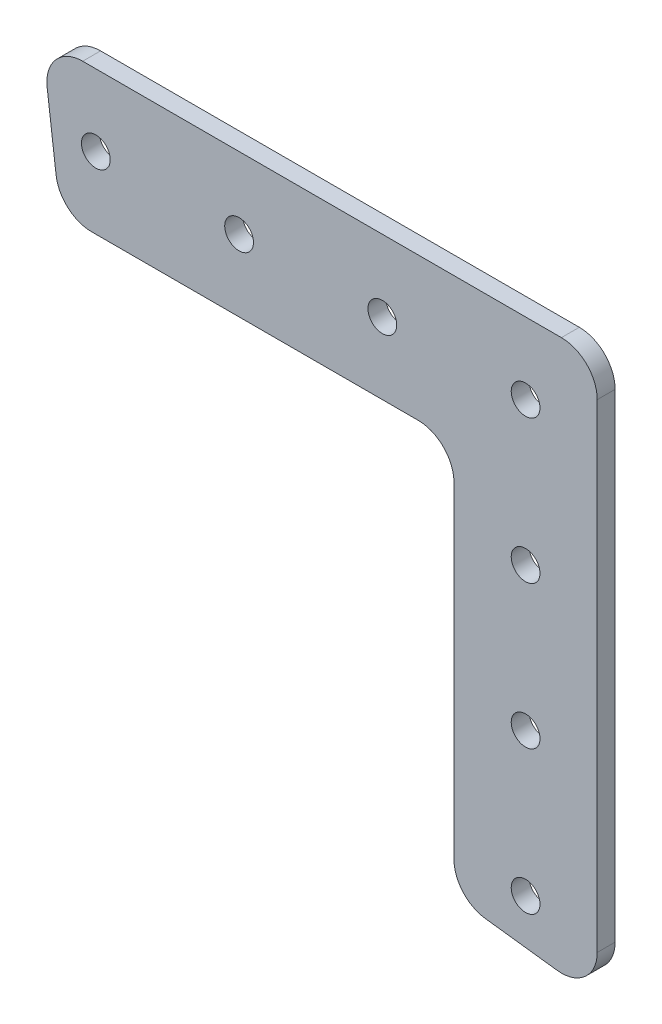
ISO-10303-21;
HEADER;
FILE_DESCRIPTION(('STEP AP214'),'2;1');
FILE_NAME('part.step','',(''),(''),'','','');
FILE_SCHEMA(('AUTOMOTIVE_DESIGN { 1 0 10303 214 1 1 1 1 }'));
ENDSEC;
DATA;
#1=APPLICATION_CONTEXT('core data for automotive mechanical design processes');
#2=APPLICATION_PROTOCOL_DEFINITION('international standard','automotive_design',2000,#1);
#3=PRODUCT_CONTEXT('',#1,'mechanical');
#4=PRODUCT('Part','Part','',(#3));
#5=PRODUCT_RELATED_PRODUCT_CATEGORY('part','',(#4));
#6=PRODUCT_DEFINITION_FORMATION('','',#4);
#7=PRODUCT_DEFINITION_CONTEXT('part definition',#1,'design');
#8=PRODUCT_DEFINITION('design','',#6,#7);
#9=PRODUCT_DEFINITION_SHAPE('','',#8);
#10=(LENGTH_UNIT() NAMED_UNIT(*) SI_UNIT(.MILLI.,.METRE.));
#11=(NAMED_UNIT(*) PLANE_ANGLE_UNIT() SI_UNIT($,.RADIAN.));
#12=(NAMED_UNIT(*) SI_UNIT($,.STERADIAN.) SOLID_ANGLE_UNIT());
#13=UNCERTAINTY_MEASURE_WITH_UNIT(LENGTH_MEASURE(1.E-05),#10,'distance_accuracy_value','');
#14=(GEOMETRIC_REPRESENTATION_CONTEXT(3) GLOBAL_UNCERTAINTY_ASSIGNED_CONTEXT((#13)) GLOBAL_UNIT_ASSIGNED_CONTEXT((#10,
#11,#12)) REPRESENTATION_CONTEXT('',''));
#15=CARTESIAN_POINT('',(0.,0.,0.));
#16=DIRECTION('',(0.,0.,1.));
#17=DIRECTION('',(1.,0.,0.));
#18=AXIS2_PLACEMENT_3D('',#15,#16,#17);
#19=CARTESIAN_POINT('',(6.35000000000038,251.668167087712,0.));
#20=DIRECTION('',(0.,0.,1.));
#21=DIRECTION('',(1.,0.,0.));
#22=AXIS2_PLACEMENT_3D('',#19,#20,#21);
#23=PLANE('',#22);
#24=CARTESIAN_POINT('',(2.25026312494075E-12,330.199999999997,0.));
#25=DIRECTION('',(0.,0.,-1.));
#26=DIRECTION('',(-1.,0.,0.));
#27=AXIS2_PLACEMENT_3D('',#24,#25,#26);
#28=CIRCLE('',#27,2.55269999999999);
#29=CARTESIAN_POINT('',(-2.55269999999774,330.199999999997,0.));
#30=VERTEX_POINT('',#29);
#31=EDGE_CURVE('E201',#30,#30,#28,.T.);
#32=ORIENTED_EDGE('',*,*,#31,.F.);
#33=EDGE_LOOP('',(#32));
#34=FACE_BOUND('',#33,.T.);
#35=CARTESIAN_POINT('',(2.07289587292752E-12,304.799999999998,0.));
#36=DIRECTION('',(0.,0.,-1.));
#37=DIRECTION('',(-1.,0.,0.));
#38=AXIS2_PLACEMENT_3D('',#35,#36,#37);
#39=CIRCLE('',#38,2.55269999999999);
#40=CARTESIAN_POINT('',(-2.55269999999792,304.799999999998,0.));
#41=VERTEX_POINT('',#40);
#42=EDGE_CURVE('E190',#41,#41,#39,.T.);
#43=ORIENTED_EDGE('',*,*,#42,.F.);
#44=EDGE_LOOP('',(#43));
#45=FACE_BOUND('',#44,.T.);
#46=CARTESIAN_POINT('',(2.22044604925031E-13,279.4,0.));
#47=DIRECTION('',(0.,0.,-1.));
#48=DIRECTION('',(-1.,0.,0.));
#49=AXIS2_PLACEMENT_3D('',#46,#47,#48);
#50=CIRCLE('',#49,2.55269999999999);
#51=CARTESIAN_POINT('',(-2.55269999999977,279.4,0.));
#52=VERTEX_POINT('',#51);
#53=EDGE_CURVE('E189',#52,#52,#50,.T.);
#54=ORIENTED_EDGE('',*,*,#53,.F.);
#55=EDGE_LOOP('',(#54));
#56=FACE_BOUND('',#55,.T.);
#57=CARTESIAN_POINT('',(-25.3999999999977,330.199999999998,0.));
#58=DIRECTION('',(0.,0.,-1.));
#59=DIRECTION('',(-1.,0.,0.));
#60=AXIS2_PLACEMENT_3D('',#57,#58,#59);
#61=CIRCLE('',#60,2.55269999999999);
#62=CARTESIAN_POINT('',(-27.9526999999977,330.199999999998,0.));
#63=VERTEX_POINT('',#62);
#64=EDGE_CURVE('E186',#63,#63,#61,.T.);
#65=ORIENTED_EDGE('',*,*,#64,.F.);
#66=EDGE_LOOP('',(#65));
#67=FACE_BOUND('',#66,.T.);
#68=CARTESIAN_POINT('',(2.22044604925031E-13,254.,0.));
#69=DIRECTION('',(0.,0.,-1.));
#70=DIRECTION('',(-1.,0.,0.));
#71=AXIS2_PLACEMENT_3D('',#68,#69,#70);
#72=CIRCLE('',#71,2.55269999999999);
#73=CARTESIAN_POINT('',(-2.55269999999977,254.,0.));
#74=VERTEX_POINT('',#73);
#75=EDGE_CURVE('E183',#74,#74,#72,.T.);
#76=ORIENTED_EDGE('',*,*,#75,.F.);
#77=EDGE_LOOP('',(#76));
#78=FACE_BOUND('',#77,.T.);
#79=CARTESIAN_POINT('',(-50.7999999999998,330.2,0.));
#80=DIRECTION('',(0.,0.,-1.));
#81=DIRECTION('',(-1.,0.,0.));
#82=AXIS2_PLACEMENT_3D('',#79,#80,#81);
#83=CIRCLE('',#82,2.55269999999999);
#84=CARTESIAN_POINT('',(-53.3526999999998,330.2,0.));
#85=VERTEX_POINT('',#84);
#86=EDGE_CURVE('E179',#85,#85,#83,.T.);
#87=ORIENTED_EDGE('',*,*,#86,.F.);
#88=EDGE_LOOP('',(#87));
#89=FACE_BOUND('',#88,.T.);
#90=DIRECTION('',(1.,0.,0.));
#91=VECTOR('',#90,1.);
#92=CARTESIAN_POINT('',(-12.6999999999978,317.499999999997,0.));
#93=LINE('',#92,#91);
#94=CARTESIAN_POINT('',(-76.9443329122879,317.5,0.));
#95=VERTEX_POINT('',#94);
#96=CARTESIAN_POINT('',(-19.0499999999978,317.499999999998,0.));
#97=VERTEX_POINT('',#96);
#98=EDGE_CURVE('E245',#95,#97,#93,.T.);
#99=ORIENTED_EDGE('',*,*,#98,.F.);
#100=CARTESIAN_POINT('',(-76.9443329122877,323.85,0.));
#101=DIRECTION('',(0.,0.,1.));
#102=DIRECTION('',(1.,0.,0.));
#103=AXIS2_PLACEMENT_3D('',#100,#101,#102);
#104=CIRCLE('',#103,6.35);
#105=CARTESIAN_POINT('',(-83.2452974294195,323.062379435358,0.));
#106=VERTEX_POINT('',#105);
#107=EDGE_CURVE('E161',#95,#106,#104,.F.);
#108=ORIENTED_EDGE('',*,*,#107,.T.);
#109=DIRECTION('',(0.1240347345892,-0.992277876713669,0.));
#110=VECTOR('',#109,1.);
#111=CARTESIAN_POINT('',(-84.8327974294194,335.762379435359,0.));
#112=LINE('',#111,#110);
#113=CARTESIAN_POINT('',(-84.8327974294194,335.762379435359,0.));
#114=VERTEX_POINT('',#113);
#115=EDGE_CURVE('E242',#114,#106,#112,.T.);
#116=ORIENTED_EDGE('',*,*,#115,.F.);
#117=CARTESIAN_POINT('',(-78.5318329122876,336.55,0.));
#118=DIRECTION('',(0.,0.,1.));
#119=DIRECTION('',(1.,0.,0.));
#120=AXIS2_PLACEMENT_3D('',#117,#118,#119);
#121=CIRCLE('',#120,6.35000000000001);
#122=CARTESIAN_POINT('',(-78.5318329122876,342.9,0.));
#123=VERTEX_POINT('',#122);
#124=EDGE_CURVE('E240',#123,#114,#121,.T.);
#125=ORIENTED_EDGE('',*,*,#124,.F.);
#126=DIRECTION('',(-1.,0.,0.));
#127=VECTOR('',#126,1.);
#128=CARTESIAN_POINT('',(6.35000000000039,342.9,0.));
#129=LINE('',#128,#127);
#130=CARTESIAN_POINT('',(6.35000000000039,342.9,0.));
#131=VERTEX_POINT('',#130);
#132=EDGE_CURVE('E238',#131,#123,#129,.T.);
#133=ORIENTED_EDGE('',*,*,#132,.F.);
#134=CARTESIAN_POINT('',(6.35000000000039,336.55,0.));
#135=DIRECTION('',(0.,0.,1.));
#136=DIRECTION('',(1.,0.,0.));
#137=AXIS2_PLACEMENT_3D('',#134,#135,#136);
#138=CIRCLE('',#137,6.35000000000001);
#139=CARTESIAN_POINT('',(12.7000000000004,336.55,0.));
#140=VERTEX_POINT('',#139);
#141=EDGE_CURVE('E236',#140,#131,#138,.T.);
#142=ORIENTED_EDGE('',*,*,#141,.F.);
#143=DIRECTION('',(0.,1.,0.));
#144=VECTOR('',#143,1.);
#145=CARTESIAN_POINT('',(12.7000000000004,251.668167087712,0.));
#146=LINE('',#145,#144);
#147=CARTESIAN_POINT('',(12.7000000000004,251.668167087712,0.));
#148=VERTEX_POINT('',#147);
#149=EDGE_CURVE('E234',#148,#140,#146,.T.);
#150=ORIENTED_EDGE('',*,*,#149,.F.);
#151=CARTESIAN_POINT('',(6.35000000000038,251.668167087712,0.));
#152=DIRECTION('',(0.,0.,1.));
#153=DIRECTION('',(1.,0.,0.));
#154=AXIS2_PLACEMENT_3D('',#151,#152,#153);
#155=CIRCLE('',#154,6.35000000000001);
#156=CARTESIAN_POINT('',(5.56237943535887,245.36720257058,0.));
#157=VERTEX_POINT('',#156);
#158=EDGE_CURVE('E232',#157,#148,#155,.T.);
#159=ORIENTED_EDGE('',*,*,#158,.F.);
#160=DIRECTION('',(0.992277876713668,-0.124034734589206,0.));
#161=VECTOR('',#160,1.);
#162=CARTESIAN_POINT('',(-12.6999999999998,247.65,0.));
#163=LINE('',#162,#161);
#164=CARTESIAN_POINT('',(-7.13762056464109,246.95470257058,0.));
#165=VERTEX_POINT('',#164);
#166=EDGE_CURVE('E147',#165,#157,#163,.T.);
#167=ORIENTED_EDGE('',*,*,#166,.F.);
#168=CARTESIAN_POINT('',(-6.34999999999963,253.255667087712,0.));
#169=DIRECTION('',(0.,0.,1.));
#170=DIRECTION('',(1.,0.,0.));
#171=AXIS2_PLACEMENT_3D('',#168,#169,#170);
#172=CIRCLE('',#171,6.35);
#173=CARTESIAN_POINT('',(-12.6999999999996,253.255667087712,0.));
#174=VERTEX_POINT('',#173);
#175=EDGE_CURVE('E159',#165,#174,#172,.F.);
#176=ORIENTED_EDGE('',*,*,#175,.T.);
#177=DIRECTION('',(0.,-1.,0.));
#178=VECTOR('',#177,1.);
#179=CARTESIAN_POINT('',(-12.6999999999998,247.65,0.));
#180=LINE('',#179,#178);
#181=CARTESIAN_POINT('',(-12.699999999998,311.149999999998,0.));
#182=VERTEX_POINT('',#181);
#183=EDGE_CURVE('E134',#182,#174,#180,.T.);
#184=ORIENTED_EDGE('',*,*,#183,.F.);
#185=CARTESIAN_POINT('',(-19.049999999998,311.149999999998,0.));
#186=DIRECTION('',(0.,0.,1.));
#187=DIRECTION('',(1.,0.,0.));
#188=AXIS2_PLACEMENT_3D('',#185,#186,#187);
#189=CIRCLE('',#188,6.35);
#190=EDGE_CURVE('E42',#182,#97,#189,.T.);
#191=ORIENTED_EDGE('',*,*,#190,.T.);
#192=EDGE_LOOP('',(#99,#108,#116,#125,#133,#142,#150,#159,#167,#176,#184,#191));
#193=FACE_BOUND('',#192,.T.);
#194=CARTESIAN_POINT('',(-76.1999999999998,330.2,0.));
#195=DIRECTION('',(0.,0.,-1.));
#196=DIRECTION('',(-1.,0.,0.));
#197=AXIS2_PLACEMENT_3D('',#194,#195,#196);
#198=CIRCLE('',#197,2.55269999999999);
#199=CARTESIAN_POINT('',(-78.7526999999998,330.2,0.));
#200=VERTEX_POINT('',#199);
#201=EDGE_CURVE('E178',#200,#200,#198,.T.);
#202=ORIENTED_EDGE('',*,*,#201,.F.);
#203=EDGE_LOOP('',(#202));
#204=FACE_BOUND('',#203,.T.);
#205=ADVANCED_FACE('F33',(#34,#45,#56,#67,#78,#89,#193,#204),#23,.F.);
#206=CARTESIAN_POINT('',(-12.6999999999998,247.65,3.175));
#207=DIRECTION('',(0.124034734589206,0.992277876713668,0.));
#208=DIRECTION('',(-0.992277876713668,0.124034734589206,0.));
#209=AXIS2_PLACEMENT_3D('',#206,#207,#208);
#210=PLANE('',#209);
#211=DIRECTION('',(0.992277876713668,-0.124034734589206,0.));
#212=VECTOR('',#211,1.);
#213=CARTESIAN_POINT('',(-12.6999999999998,247.65,3.175));
#214=LINE('',#213,#212);
#215=CARTESIAN_POINT('',(-7.13762056464109,246.95470257058,3.175));
#216=VERTEX_POINT('',#215);
#217=CARTESIAN_POINT('',(5.56237943535887,245.36720257058,3.175));
#218=VERTEX_POINT('',#217);
#219=EDGE_CURVE('E122',#216,#218,#214,.T.);
#220=ORIENTED_EDGE('',*,*,#219,.F.);
#221=DIRECTION('',(0.,0.,-1.));
#222=VECTOR('',#221,1.);
#223=CARTESIAN_POINT('',(-7.13762056464109,246.95470257058,3.175));
#224=LINE('',#223,#222);
#225=EDGE_CURVE('E172',#216,#165,#224,.T.);
#226=ORIENTED_EDGE('',*,*,#225,.T.);
#227=ORIENTED_EDGE('',*,*,#166,.T.);
#228=DIRECTION('',(0.,0.,-1.));
#229=VECTOR('',#228,1.);
#230=CARTESIAN_POINT('',(5.56237943535887,245.36720257058,3.175));
#231=LINE('',#230,#229);
#232=EDGE_CURVE('E139',#218,#157,#231,.T.);
#233=ORIENTED_EDGE('',*,*,#232,.F.);
#234=EDGE_LOOP('',(#220,#226,#227,#233));
#235=FACE_BOUND('',#234,.T.);
#236=ADVANCED_FACE('F145',(#235),#210,.F.);
#237=CARTESIAN_POINT('',(6.35000000000038,251.668167087712,3.175));
#238=DIRECTION('',(0.,0.,-1.));
#239=DIRECTION('',(-1.,0.,0.));
#240=AXIS2_PLACEMENT_3D('',#237,#238,#239);
#241=CYLINDRICAL_SURFACE('',#240,6.35000000000001);
#242=ORIENTED_EDGE('',*,*,#158,.T.);
#243=DIRECTION('',(0.,0.,-1.));
#244=VECTOR('',#243,1.);
#245=CARTESIAN_POINT('',(12.7000000000004,251.668167087712,3.175));
#246=LINE('',#245,#244);
#247=CARTESIAN_POINT('',(12.7000000000004,251.668167087712,3.175));
#248=VERTEX_POINT('',#247);
#249=EDGE_CURVE('E141',#248,#148,#246,.T.);
#250=ORIENTED_EDGE('',*,*,#249,.F.);
#251=CARTESIAN_POINT('',(6.35000000000038,251.668167087712,3.175));
#252=DIRECTION('',(0.,0.,1.));
#253=DIRECTION('',(1.,0.,0.));
#254=AXIS2_PLACEMENT_3D('',#251,#252,#253);
#255=CIRCLE('',#254,6.35000000000001);
#256=EDGE_CURVE('E126',#218,#248,#255,.T.);
#257=ORIENTED_EDGE('',*,*,#256,.F.);
#258=ORIENTED_EDGE('',*,*,#232,.T.);
#259=EDGE_LOOP('',(#242,#250,#257,#258));
#260=FACE_BOUND('',#259,.T.);
#261=ADVANCED_FACE('F138',(#260),#241,.T.);
#262=CARTESIAN_POINT('',(12.7000000000004,251.668167087712,3.175));
#263=DIRECTION('',(-1.,0.,0.));
#264=DIRECTION('',(0.,-1.,0.));
#265=AXIS2_PLACEMENT_3D('',#262,#263,#264);
#266=PLANE('',#265);
#267=ORIENTED_EDGE('',*,*,#149,.T.);
#268=DIRECTION('',(0.,0.,-1.));
#269=VECTOR('',#268,1.);
#270=CARTESIAN_POINT('',(12.7000000000004,336.55,3.175));
#271=LINE('',#270,#269);
#272=CARTESIAN_POINT('',(12.7000000000004,336.55,3.175));
#273=VERTEX_POINT('',#272);
#274=EDGE_CURVE('E153',#273,#140,#271,.T.);
#275=ORIENTED_EDGE('',*,*,#274,.F.);
#276=DIRECTION('',(0.,1.,0.));
#277=VECTOR('',#276,1.);
#278=CARTESIAN_POINT('',(12.7000000000004,251.668167087712,3.175));
#279=LINE('',#278,#277);
#280=EDGE_CURVE('E143',#248,#273,#279,.T.);
#281=ORIENTED_EDGE('',*,*,#280,.F.);
#282=ORIENTED_EDGE('',*,*,#249,.T.);
#283=EDGE_LOOP('',(#267,#275,#281,#282));
#284=FACE_BOUND('',#283,.T.);
#285=ADVANCED_FACE('F281',(#284),#266,.F.);
#286=CARTESIAN_POINT('',(6.35000000000039,336.55,3.175));
#287=DIRECTION('',(0.,0.,-1.));
#288=DIRECTION('',(-1.,0.,0.));
#289=AXIS2_PLACEMENT_3D('',#286,#287,#288);
#290=CYLINDRICAL_SURFACE('',#289,6.35000000000001);
#291=ORIENTED_EDGE('',*,*,#141,.T.);
#292=DIRECTION('',(0.,0.,-1.));
#293=VECTOR('',#292,1.);
#294=CARTESIAN_POINT('',(6.35000000000039,342.9,3.175));
#295=LINE('',#294,#293);
#296=CARTESIAN_POINT('',(6.35000000000039,342.9,3.175));
#297=VERTEX_POINT('',#296);
#298=EDGE_CURVE('E254',#297,#131,#295,.T.);
#299=ORIENTED_EDGE('',*,*,#298,.F.);
#300=CARTESIAN_POINT('',(6.35000000000039,336.55,3.175));
#301=DIRECTION('',(0.,0.,1.));
#302=DIRECTION('',(1.,0.,0.));
#303=AXIS2_PLACEMENT_3D('',#300,#301,#302);
#304=CIRCLE('',#303,6.35000000000001);
#305=EDGE_CURVE('E218',#273,#297,#304,.T.);
#306=ORIENTED_EDGE('',*,*,#305,.F.);
#307=ORIENTED_EDGE('',*,*,#274,.T.);
#308=EDGE_LOOP('',(#291,#299,#306,#307));
#309=FACE_BOUND('',#308,.T.);
#310=ADVANCED_FACE('F261',(#309),#290,.T.);
#311=CARTESIAN_POINT('',(6.35000000000039,342.9,3.175));
#312=DIRECTION('',(0.,-1.,0.));
#313=DIRECTION('',(0.,0.,-1.));
#314=AXIS2_PLACEMENT_3D('',#311,#312,#313);
#315=PLANE('',#314);
#316=ORIENTED_EDGE('',*,*,#132,.T.);
#317=DIRECTION('',(0.,0.,-1.));
#318=VECTOR('',#317,1.);
#319=CARTESIAN_POINT('',(-78.5318329122876,342.9,3.175));
#320=LINE('',#319,#318);
#321=CARTESIAN_POINT('',(-78.5318329122876,342.9,3.175));
#322=VERTEX_POINT('',#321);
#323=EDGE_CURVE('E251',#322,#123,#320,.T.);
#324=ORIENTED_EDGE('',*,*,#323,.F.);
#325=DIRECTION('',(-1.,0.,0.));
#326=VECTOR('',#325,1.);
#327=CARTESIAN_POINT('',(6.35000000000039,342.9,3.175));
#328=LINE('',#327,#326);
#329=EDGE_CURVE('E220',#297,#322,#328,.T.);
#330=ORIENTED_EDGE('',*,*,#329,.F.);
#331=ORIENTED_EDGE('',*,*,#298,.T.);
#332=EDGE_LOOP('',(#316,#324,#330,#331));
#333=FACE_BOUND('',#332,.T.);
#334=ADVANCED_FACE('F273',(#333),#315,.F.);
#335=CARTESIAN_POINT('',(-78.5318329122876,336.55,3.175));
#336=DIRECTION('',(0.,0.,-1.));
#337=DIRECTION('',(-1.,0.,0.));
#338=AXIS2_PLACEMENT_3D('',#335,#336,#337);
#339=CYLINDRICAL_SURFACE('',#338,6.35000000000001);
#340=ORIENTED_EDGE('',*,*,#124,.T.);
#341=DIRECTION('',(0.,0.,-1.));
#342=VECTOR('',#341,1.);
#343=CARTESIAN_POINT('',(-84.8327974294194,335.762379435359,3.175));
#344=LINE('',#343,#342);
#345=CARTESIAN_POINT('',(-84.8327974294194,335.762379435359,3.175));
#346=VERTEX_POINT('',#345);
#347=EDGE_CURVE('E230',#346,#114,#344,.T.);
#348=ORIENTED_EDGE('',*,*,#347,.F.);
#349=CARTESIAN_POINT('',(-78.5318329122876,336.55,3.175));
#350=DIRECTION('',(0.,0.,1.));
#351=DIRECTION('',(1.,0.,0.));
#352=AXIS2_PLACEMENT_3D('',#349,#350,#351);
#353=CIRCLE('',#352,6.35000000000001);
#354=EDGE_CURVE('E222',#322,#346,#353,.T.);
#355=ORIENTED_EDGE('',*,*,#354,.F.);
#356=ORIENTED_EDGE('',*,*,#323,.T.);
#357=EDGE_LOOP('',(#340,#348,#355,#356));
#358=FACE_BOUND('',#357,.T.);
#359=ADVANCED_FACE('F277',(#358),#339,.T.);
#360=CARTESIAN_POINT('',(-84.8327974294194,335.762379435359,3.175));
#361=DIRECTION('',(0.992277876713669,0.1240347345892,0.));
#362=DIRECTION('',(-0.1240347345892,0.992277876713669,0.));
#363=AXIS2_PLACEMENT_3D('',#360,#361,#362);
#364=PLANE('',#363);
#365=ORIENTED_EDGE('',*,*,#115,.T.);
#366=DIRECTION('',(0.,0.,-1.));
#367=VECTOR('',#366,1.);
#368=CARTESIAN_POINT('',(-83.2452974294195,323.062379435358,3.175));
#369=LINE('',#368,#367);
#370=CARTESIAN_POINT('',(-83.2452974294195,323.062379435358,3.175));
#371=VERTEX_POINT('',#370);
#372=EDGE_CURVE('E163',#106,#371,#369,.F.);
#373=ORIENTED_EDGE('',*,*,#372,.T.);
#374=DIRECTION('',(0.1240347345892,-0.992277876713669,0.));
#375=VECTOR('',#374,1.);
#376=CARTESIAN_POINT('',(-84.8327974294194,335.762379435359,3.175));
#377=LINE('',#376,#375);
#378=EDGE_CURVE('E224',#346,#371,#377,.T.);
#379=ORIENTED_EDGE('',*,*,#378,.F.);
#380=ORIENTED_EDGE('',*,*,#347,.T.);
#381=EDGE_LOOP('',(#365,#373,#379,#380));
#382=FACE_BOUND('',#381,.T.);
#383=ADVANCED_FACE('F308',(#382),#364,.F.);
#384=CARTESIAN_POINT('',(-12.6999999999978,317.499999999997,3.175));
#385=DIRECTION('',(0.,1.,0.));
#386=DIRECTION('',(-1.,0.,0.));
#387=AXIS2_PLACEMENT_3D('',#384,#385,#386);
#388=PLANE('',#387);
#389=DIRECTION('',(1.,0.,0.));
#390=VECTOR('',#389,1.);
#391=CARTESIAN_POINT('',(-12.6999999999978,317.499999999997,3.175));
#392=LINE('',#391,#390);
#393=CARTESIAN_POINT('',(-76.9443329122879,317.5,3.175));
#394=VERTEX_POINT('',#393);
#395=CARTESIAN_POINT('',(-19.0499999999978,317.499999999998,3.175));
#396=VERTEX_POINT('',#395);
#397=EDGE_CURVE('E226',#394,#396,#392,.T.);
#398=ORIENTED_EDGE('',*,*,#397,.F.);
#399=DIRECTION('',(0.,0.,-1.));
#400=VECTOR('',#399,1.);
#401=CARTESIAN_POINT('',(-76.9443329122879,317.5,3.175));
#402=LINE('',#401,#400);
#403=EDGE_CURVE('E151',#394,#95,#402,.T.);
#404=ORIENTED_EDGE('',*,*,#403,.T.);
#405=ORIENTED_EDGE('',*,*,#98,.T.);
#406=DIRECTION('',(0.,0.,-1.));
#407=VECTOR('',#406,1.);
#408=CARTESIAN_POINT('',(-19.0499999999978,317.499999999998,3.175));
#409=LINE('',#408,#407);
#410=EDGE_CURVE('E149',#97,#396,#409,.F.);
#411=ORIENTED_EDGE('',*,*,#410,.T.);
#412=EDGE_LOOP('',(#398,#404,#405,#411));
#413=FACE_BOUND('',#412,.T.);
#414=ADVANCED_FACE('F305',(#413),#388,.F.);
#415=CARTESIAN_POINT('',(-12.6999999999998,247.65,3.175));
#416=DIRECTION('',(1.,0.,0.));
#417=DIRECTION('',(0.,1.,0.));
#418=AXIS2_PLACEMENT_3D('',#415,#416,#417);
#419=PLANE('',#418);
#420=DIRECTION('',(0.,-1.,0.));
#421=VECTOR('',#420,1.);
#422=CARTESIAN_POINT('',(-12.6999999999998,247.65,3.175));
#423=LINE('',#422,#421);
#424=CARTESIAN_POINT('',(-12.699999999998,311.149999999998,3.175));
#425=VERTEX_POINT('',#424);
#426=CARTESIAN_POINT('',(-12.6999999999996,253.255667087712,3.175));
#427=VERTEX_POINT('',#426);
#428=EDGE_CURVE('E228',#425,#427,#423,.T.);
#429=ORIENTED_EDGE('',*,*,#428,.F.);
#430=DIRECTION('',(0.,0.,-1.));
#431=VECTOR('',#430,1.);
#432=CARTESIAN_POINT('',(-12.699999999998,311.149999999998,0.));
#433=LINE('',#432,#431);
#434=EDGE_CURVE('E169',#425,#182,#433,.T.);
#435=ORIENTED_EDGE('',*,*,#434,.T.);
#436=ORIENTED_EDGE('',*,*,#183,.T.);
#437=DIRECTION('',(0.,0.,-1.));
#438=VECTOR('',#437,1.);
#439=CARTESIAN_POINT('',(-12.6999999999996,253.255667087712,3.175));
#440=LINE('',#439,#438);
#441=EDGE_CURVE('E50',#174,#427,#440,.F.);
#442=ORIENTED_EDGE('',*,*,#441,.T.);
#443=EDGE_LOOP('',(#429,#435,#436,#442));
#444=FACE_BOUND('',#443,.T.);
#445=ADVANCED_FACE('F302',(#444),#419,.F.);
#446=CARTESIAN_POINT('',(6.35000000000038,251.668167087712,3.175));
#447=DIRECTION('',(0.,0.,1.));
#448=DIRECTION('',(1.,0.,0.));
#449=AXIS2_PLACEMENT_3D('',#446,#447,#448);
#450=PLANE('',#449);
#451=CARTESIAN_POINT('',(2.25026312494075E-12,330.199999999997,3.175));
#452=DIRECTION('',(0.,0.,1.));
#453=DIRECTION('',(1.,0.,0.));
#454=AXIS2_PLACEMENT_3D('',#451,#452,#453);
#455=CIRCLE('',#454,2.55269999999999);
#456=CARTESIAN_POINT('',(2.55270000000224,330.199999999997,3.175));
#457=VERTEX_POINT('',#456);
#458=EDGE_CURVE('E37',#457,#457,#455,.T.);
#459=ORIENTED_EDGE('',*,*,#458,.F.);
#460=EDGE_LOOP('',(#459));
#461=FACE_BOUND('',#460,.T.);
#462=CARTESIAN_POINT('',(2.07289587292752E-12,304.799999999998,3.175));
#463=DIRECTION('',(0.,0.,1.));
#464=DIRECTION('',(1.,0.,0.));
#465=AXIS2_PLACEMENT_3D('',#462,#463,#464);
#466=CIRCLE('',#465,2.55269999999999);
#467=CARTESIAN_POINT('',(2.55270000000206,304.799999999998,3.175));
#468=VERTEX_POINT('',#467);
#469=EDGE_CURVE('E187',#468,#468,#466,.T.);
#470=ORIENTED_EDGE('',*,*,#469,.F.);
#471=EDGE_LOOP('',(#470));
#472=FACE_BOUND('',#471,.T.);
#473=CARTESIAN_POINT('',(2.22044604925031E-13,279.4,3.175));
#474=DIRECTION('',(0.,0.,1.));
#475=DIRECTION('',(1.,0.,0.));
#476=AXIS2_PLACEMENT_3D('',#473,#474,#475);
#477=CIRCLE('',#476,2.55269999999999);
#478=CARTESIAN_POINT('',(2.55270000000021,279.4,3.175));
#479=VERTEX_POINT('',#478);
#480=EDGE_CURVE('E194',#479,#479,#477,.T.);
#481=ORIENTED_EDGE('',*,*,#480,.F.);
#482=EDGE_LOOP('',(#481));
#483=FACE_BOUND('',#482,.T.);
#484=CARTESIAN_POINT('',(-25.3999999999977,330.199999999998,3.175));
#485=DIRECTION('',(0.,0.,1.));
#486=DIRECTION('',(1.,0.,0.));
#487=AXIS2_PLACEMENT_3D('',#484,#485,#486);
#488=CIRCLE('',#487,2.55269999999999);
#489=CARTESIAN_POINT('',(-22.8472999999977,330.199999999998,3.175));
#490=VERTEX_POINT('',#489);
#491=EDGE_CURVE('E184',#490,#490,#488,.T.);
#492=ORIENTED_EDGE('',*,*,#491,.F.);
#493=EDGE_LOOP('',(#492));
#494=FACE_BOUND('',#493,.T.);
#495=CARTESIAN_POINT('',(2.22044604925031E-13,254.,3.175));
#496=DIRECTION('',(0.,0.,1.));
#497=DIRECTION('',(1.,0.,0.));
#498=AXIS2_PLACEMENT_3D('',#495,#496,#497);
#499=CIRCLE('',#498,2.55269999999999);
#500=CARTESIAN_POINT('',(2.55270000000021,254.,3.175));
#501=VERTEX_POINT('',#500);
#502=EDGE_CURVE('E180',#501,#501,#499,.T.);
#503=ORIENTED_EDGE('',*,*,#502,.F.);
#504=EDGE_LOOP('',(#503));
#505=FACE_BOUND('',#504,.T.);
#506=CARTESIAN_POINT('',(-50.7999999999998,330.2,3.175));
#507=DIRECTION('',(0.,0.,1.));
#508=DIRECTION('',(1.,0.,0.));
#509=AXIS2_PLACEMENT_3D('',#506,#507,#508);
#510=CIRCLE('',#509,2.55269999999999);
#511=CARTESIAN_POINT('',(-48.2472999999998,330.2,3.175));
#512=VERTEX_POINT('',#511);
#513=EDGE_CURVE('E175',#512,#512,#510,.T.);
#514=ORIENTED_EDGE('',*,*,#513,.F.);
#515=EDGE_LOOP('',(#514));
#516=FACE_BOUND('',#515,.T.);
#517=CARTESIAN_POINT('',(-76.1999999999998,330.2,3.175));
#518=DIRECTION('',(0.,0.,1.));
#519=DIRECTION('',(1.,0.,0.));
#520=AXIS2_PLACEMENT_3D('',#517,#518,#519);
#521=CIRCLE('',#520,2.55269999999999);
#522=CARTESIAN_POINT('',(-73.6472999999998,330.2,3.175));
#523=VERTEX_POINT('',#522);
#524=EDGE_CURVE('E214',#523,#523,#521,.T.);
#525=ORIENTED_EDGE('',*,*,#524,.F.);
#526=EDGE_LOOP('',(#525));
#527=FACE_BOUND('',#526,.T.);
#528=ORIENTED_EDGE('',*,*,#378,.T.);
#529=CARTESIAN_POINT('',(-76.9443329122877,323.85,3.175));
#530=DIRECTION('',(0.,0.,1.));
#531=DIRECTION('',(1.,0.,0.));
#532=AXIS2_PLACEMENT_3D('',#529,#530,#531);
#533=CIRCLE('',#532,6.35);
#534=EDGE_CURVE('E166',#371,#394,#533,.T.);
#535=ORIENTED_EDGE('',*,*,#534,.T.);
#536=ORIENTED_EDGE('',*,*,#397,.T.);
#537=CARTESIAN_POINT('',(-19.049999999998,311.149999999998,3.175));
#538=DIRECTION('',(0.,0.,1.));
#539=DIRECTION('',(1.,0.,0.));
#540=AXIS2_PLACEMENT_3D('',#537,#538,#539);
#541=CIRCLE('',#540,6.35);
#542=EDGE_CURVE('E11',#396,#425,#541,.F.);
#543=ORIENTED_EDGE('',*,*,#542,.T.);
#544=ORIENTED_EDGE('',*,*,#428,.T.);
#545=CARTESIAN_POINT('',(-6.34999999999963,253.255667087712,3.175));
#546=DIRECTION('',(0.,0.,1.));
#547=DIRECTION('',(1.,0.,0.));
#548=AXIS2_PLACEMENT_3D('',#545,#546,#547);
#549=CIRCLE('',#548,6.35);
#550=EDGE_CURVE('E129',#427,#216,#549,.T.);
#551=ORIENTED_EDGE('',*,*,#550,.T.);
#552=ORIENTED_EDGE('',*,*,#219,.T.);
#553=ORIENTED_EDGE('',*,*,#256,.T.);
#554=ORIENTED_EDGE('',*,*,#280,.T.);
#555=ORIENTED_EDGE('',*,*,#305,.T.);
#556=ORIENTED_EDGE('',*,*,#329,.T.);
#557=ORIENTED_EDGE('',*,*,#354,.T.);
#558=EDGE_LOOP('',(#528,#535,#536,#543,#544,#551,#552,#553,#554,#555,#556,#557));
#559=FACE_BOUND('',#558,.T.);
#560=ADVANCED_FACE('F125',(#461,#472,#483,#494,#505,#516,#527,#559),#450,.T.);
#561=CARTESIAN_POINT('',(-76.9443329122877,323.85,3.175));
#562=DIRECTION('',(0.,0.,-1.));
#563=DIRECTION('',(-1.,0.,0.));
#564=AXIS2_PLACEMENT_3D('',#561,#562,#563);
#565=CYLINDRICAL_SURFACE('',#564,6.35);
#566=ORIENTED_EDGE('',*,*,#534,.F.);
#567=ORIENTED_EDGE('',*,*,#372,.F.);
#568=ORIENTED_EDGE('',*,*,#107,.F.);
#569=ORIENTED_EDGE('',*,*,#403,.F.);
#570=EDGE_LOOP('',(#566,#567,#568,#569));
#571=FACE_BOUND('',#570,.T.);
#572=ADVANCED_FACE('F344',(#571),#565,.T.);
#573=CARTESIAN_POINT('',(-19.049999999998,311.149999999998,3.175));
#574=DIRECTION('',(0.,0.,1.));
#575=DIRECTION('',(1.,0.,0.));
#576=AXIS2_PLACEMENT_3D('',#573,#574,#575);
#577=CYLINDRICAL_SURFACE('',#576,6.35);
#578=ORIENTED_EDGE('',*,*,#542,.F.);
#579=ORIENTED_EDGE('',*,*,#410,.F.);
#580=ORIENTED_EDGE('',*,*,#190,.F.);
#581=ORIENTED_EDGE('',*,*,#434,.F.);
#582=EDGE_LOOP('',(#578,#579,#580,#581));
#583=FACE_BOUND('',#582,.T.);
#584=ADVANCED_FACE('F351',(#583),#577,.F.);
#585=CARTESIAN_POINT('',(-6.34999999999963,253.255667087712,3.175));
#586=DIRECTION('',(0.,0.,-1.));
#587=DIRECTION('',(-1.,0.,0.));
#588=AXIS2_PLACEMENT_3D('',#585,#586,#587);
#589=CYLINDRICAL_SURFACE('',#588,6.35);
#590=ORIENTED_EDGE('',*,*,#550,.F.);
#591=ORIENTED_EDGE('',*,*,#441,.F.);
#592=ORIENTED_EDGE('',*,*,#175,.F.);
#593=ORIENTED_EDGE('',*,*,#225,.F.);
#594=EDGE_LOOP('',(#590,#591,#592,#593));
#595=FACE_BOUND('',#594,.T.);
#596=ADVANCED_FACE('F35',(#595),#589,.T.);
#597=CARTESIAN_POINT('',(-76.1999999999998,330.2,0.));
#598=DIRECTION('',(0.,0.,-1.));
#599=DIRECTION('',(-1.,0.,0.));
#600=AXIS2_PLACEMENT_3D('',#597,#598,#599);
#601=CYLINDRICAL_SURFACE('',#600,2.55269999999999);
#602=ORIENTED_EDGE('',*,*,#524,.T.);
#603=EDGE_LOOP('',(#602));
#604=FACE_BOUND('',#603,.T.);
#605=ORIENTED_EDGE('',*,*,#201,.T.);
#606=EDGE_LOOP('',(#605));
#607=FACE_BOUND('',#606,.T.);
#608=ADVANCED_FACE('F365',(#604,#607),#601,.F.);
#609=CARTESIAN_POINT('',(-50.7999999999998,330.2,0.));
#610=DIRECTION('',(0.,0.,-1.));
#611=DIRECTION('',(-1.,0.,0.));
#612=AXIS2_PLACEMENT_3D('',#609,#610,#611);
#613=CYLINDRICAL_SURFACE('',#612,2.55269999999999);
#614=ORIENTED_EDGE('',*,*,#513,.T.);
#615=EDGE_LOOP('',(#614));
#616=FACE_BOUND('',#615,.T.);
#617=ORIENTED_EDGE('',*,*,#86,.T.);
#618=EDGE_LOOP('',(#617));
#619=FACE_BOUND('',#618,.T.);
#620=ADVANCED_FACE('F371',(#616,#619),#613,.F.);
#621=CARTESIAN_POINT('',(2.22044604925031E-13,254.,0.));
#622=DIRECTION('',(0.,0.,-1.));
#623=DIRECTION('',(-1.,0.,0.));
#624=AXIS2_PLACEMENT_3D('',#621,#622,#623);
#625=CYLINDRICAL_SURFACE('',#624,2.55269999999999);
#626=ORIENTED_EDGE('',*,*,#502,.T.);
#627=EDGE_LOOP('',(#626));
#628=FACE_BOUND('',#627,.T.);
#629=ORIENTED_EDGE('',*,*,#75,.T.);
#630=EDGE_LOOP('',(#629));
#631=FACE_BOUND('',#630,.T.);
#632=ADVANCED_FACE('F378',(#628,#631),#625,.F.);
#633=CARTESIAN_POINT('',(-25.3999999999977,330.199999999998,0.));
#634=DIRECTION('',(0.,0.,-1.));
#635=DIRECTION('',(-1.,0.,0.));
#636=AXIS2_PLACEMENT_3D('',#633,#634,#635);
#637=CYLINDRICAL_SURFACE('',#636,2.55269999999999);
#638=ORIENTED_EDGE('',*,*,#491,.T.);
#639=EDGE_LOOP('',(#638));
#640=FACE_BOUND('',#639,.T.);
#641=ORIENTED_EDGE('',*,*,#64,.T.);
#642=EDGE_LOOP('',(#641));
#643=FACE_BOUND('',#642,.T.);
#644=ADVANCED_FACE('F386',(#640,#643),#637,.F.);
#645=CARTESIAN_POINT('',(2.22044604925031E-13,279.4,0.));
#646=DIRECTION('',(0.,0.,-1.));
#647=DIRECTION('',(-1.,0.,0.));
#648=AXIS2_PLACEMENT_3D('',#645,#646,#647);
#649=CYLINDRICAL_SURFACE('',#648,2.55269999999999);
#650=ORIENTED_EDGE('',*,*,#480,.T.);
#651=EDGE_LOOP('',(#650));
#652=FACE_BOUND('',#651,.T.);
#653=ORIENTED_EDGE('',*,*,#53,.T.);
#654=EDGE_LOOP('',(#653));
#655=FACE_BOUND('',#654,.T.);
#656=ADVANCED_FACE('F394',(#652,#655),#649,.F.);
#657=CARTESIAN_POINT('',(2.07289587292752E-12,304.799999999998,0.));
#658=DIRECTION('',(0.,0.,-1.));
#659=DIRECTION('',(-1.,0.,0.));
#660=AXIS2_PLACEMENT_3D('',#657,#658,#659);
#661=CYLINDRICAL_SURFACE('',#660,2.55269999999999);
#662=ORIENTED_EDGE('',*,*,#469,.T.);
#663=EDGE_LOOP('',(#662));
#664=FACE_BOUND('',#663,.T.);
#665=ORIENTED_EDGE('',*,*,#42,.T.);
#666=EDGE_LOOP('',(#665));
#667=FACE_BOUND('',#666,.T.);
#668=ADVANCED_FACE('F402',(#664,#667),#661,.F.);
#669=CARTESIAN_POINT('',(2.25026312494075E-12,330.199999999997,0.));
#670=DIRECTION('',(0.,0.,-1.));
#671=DIRECTION('',(-1.,0.,0.));
#672=AXIS2_PLACEMENT_3D('',#669,#670,#671);
#673=CYLINDRICAL_SURFACE('',#672,2.55269999999999);
#674=ORIENTED_EDGE('',*,*,#458,.T.);
#675=EDGE_LOOP('',(#674));
#676=FACE_BOUND('',#675,.T.);
#677=ORIENTED_EDGE('',*,*,#31,.T.);
#678=EDGE_LOOP('',(#677));
#679=FACE_BOUND('',#678,.T.);
#680=ADVANCED_FACE('F410',(#676,#679),#673,.F.);
#681=CLOSED_SHELL('',(#205,#236,#261,#285,#310,#334,#359,#383,#414,#445,#560,#572,#584,#596,
#608,#620,#632,#644,#656,#668,#680));
#682=MANIFOLD_SOLID_BREP('B2',#681);
#683=ADVANCED_BREP_SHAPE_REPRESENTATION('',(#18,#682),#14);
#684=SHAPE_DEFINITION_REPRESENTATION(#9,#683);
ENDSEC;
END-ISO-10303-21;
